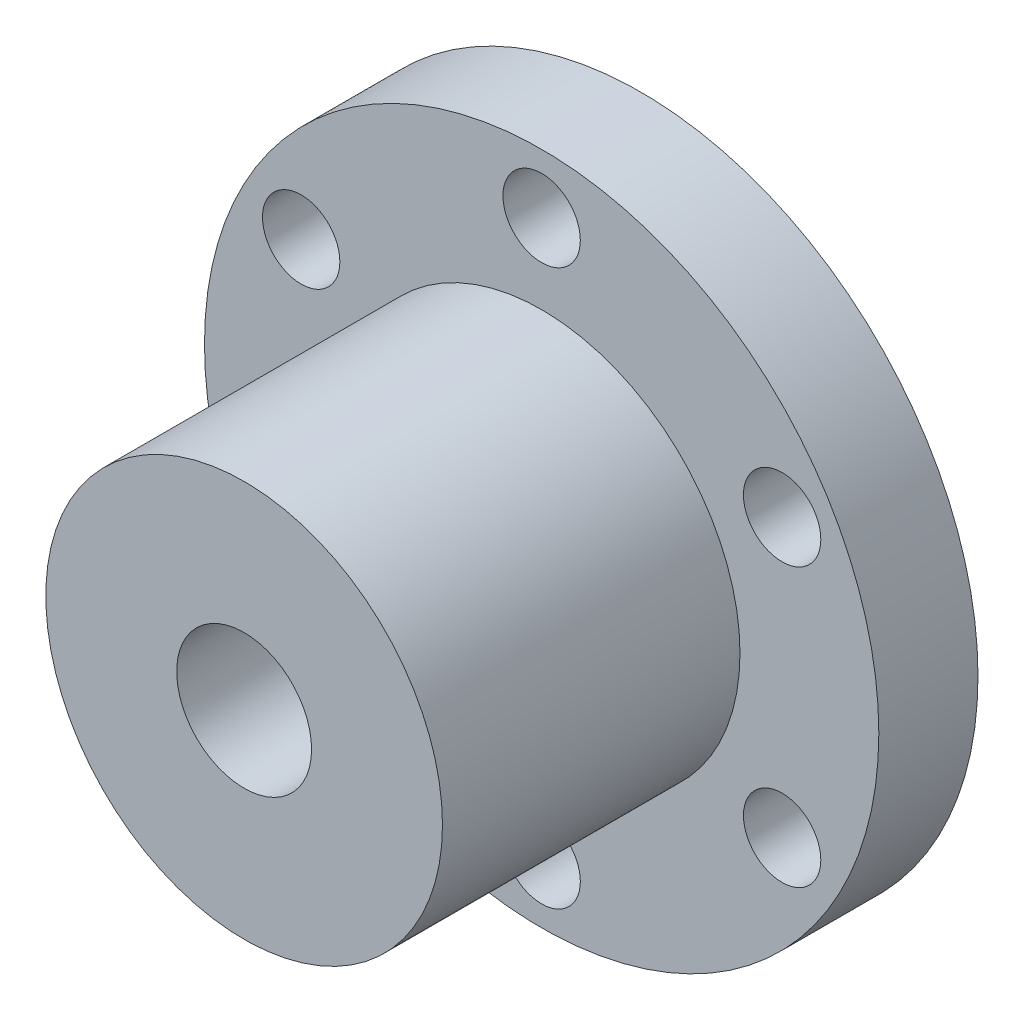
ISO-10303-21;
HEADER;
FILE_DESCRIPTION(('STEP AP214'),'2;1');
FILE_NAME('part.step','',(''),(''),'','','');
FILE_SCHEMA(('AUTOMOTIVE_DESIGN { 1 0 10303 214 1 1 1 1 }'));
ENDSEC;
DATA;
#1=APPLICATION_CONTEXT('core data for automotive mechanical design processes');
#2=APPLICATION_PROTOCOL_DEFINITION('international standard','automotive_design',2000,#1);
#3=PRODUCT_CONTEXT('',#1,'mechanical');
#4=PRODUCT('Part','Part','',(#3));
#5=PRODUCT_RELATED_PRODUCT_CATEGORY('part','',(#4));
#6=PRODUCT_DEFINITION_FORMATION('','',#4);
#7=PRODUCT_DEFINITION_CONTEXT('part definition',#1,'design');
#8=PRODUCT_DEFINITION('design','',#6,#7);
#9=PRODUCT_DEFINITION_SHAPE('','',#8);
#10=(LENGTH_UNIT() NAMED_UNIT(*) SI_UNIT(.MILLI.,.METRE.));
#11=(NAMED_UNIT(*) PLANE_ANGLE_UNIT() SI_UNIT($,.RADIAN.));
#12=(NAMED_UNIT(*) SI_UNIT($,.STERADIAN.) SOLID_ANGLE_UNIT());
#13=UNCERTAINTY_MEASURE_WITH_UNIT(LENGTH_MEASURE(1.E-05),#10,'distance_accuracy_value','');
#14=(GEOMETRIC_REPRESENTATION_CONTEXT(3) GLOBAL_UNCERTAINTY_ASSIGNED_CONTEXT((#13)) GLOBAL_UNIT_ASSIGNED_CONTEXT((#10,
#11,#12)) REPRESENTATION_CONTEXT('',''));
#15=CARTESIAN_POINT('',(0.,0.,0.));
#16=DIRECTION('',(0.,0.,1.));
#17=DIRECTION('',(1.,0.,0.));
#18=AXIS2_PLACEMENT_3D('',#15,#16,#17);
#19=CARTESIAN_POINT('',(0.,0.,0.));
#20=DIRECTION('',(0.,0.,-1.));
#21=DIRECTION('',(-1.,0.,0.));
#22=AXIS2_PLACEMENT_3D('',#19,#20,#21);
#23=PLANE('',#22);
#24=CARTESIAN_POINT('',(12.1243556529821,7.00000000000014,0.));
#25=DIRECTION('',(0.,0.,-1.));
#26=DIRECTION('',(-1.,0.,0.));
#27=AXIS2_PLACEMENT_3D('',#24,#25,#26);
#28=CIRCLE('',#27,1.94999999999994);
#29=CARTESIAN_POINT('',(10.1743556529821,7.00000000000014,0.));
#30=VERTEX_POINT('',#29);
#31=EDGE_CURVE('E94',#30,#30,#28,.T.);
#32=ORIENTED_EDGE('',*,*,#31,.F.);
#33=EDGE_LOOP('',(#32));
#34=FACE_BOUND('',#33,.T.);
#35=CARTESIAN_POINT('',(12.1243556529822,-6.99999999999989,0.));
#36=DIRECTION('',(0.,0.,-1.));
#37=DIRECTION('',(-1.,0.,0.));
#38=AXIS2_PLACEMENT_3D('',#35,#36,#37);
#39=CIRCLE('',#38,1.94999999999994);
#40=CARTESIAN_POINT('',(10.1743556529823,-6.99999999999989,0.));
#41=VERTEX_POINT('',#40);
#42=EDGE_CURVE('E88',#41,#41,#39,.T.);
#43=ORIENTED_EDGE('',*,*,#42,.F.);
#44=EDGE_LOOP('',(#43));
#45=FACE_BOUND('',#44,.T.);
#46=CARTESIAN_POINT('',(0.,-14.,0.));
#47=DIRECTION('',(0.,0.,-1.));
#48=DIRECTION('',(-1.,0.,0.));
#49=AXIS2_PLACEMENT_3D('',#46,#47,#48);
#50=CIRCLE('',#49,1.94999999999994);
#51=CARTESIAN_POINT('',(-1.94999999999994,-14.,0.));
#52=VERTEX_POINT('',#51);
#53=EDGE_CURVE('E82',#52,#52,#50,.T.);
#54=ORIENTED_EDGE('',*,*,#53,.F.);
#55=EDGE_LOOP('',(#54));
#56=FACE_BOUND('',#55,.T.);
#57=CARTESIAN_POINT('',(-12.1243556529821,-7.00000000000006,0.));
#58=DIRECTION('',(0.,0.,-1.));
#59=DIRECTION('',(-1.,0.,0.));
#60=AXIS2_PLACEMENT_3D('',#57,#58,#59);
#61=CIRCLE('',#60,1.94999999999994);
#62=CARTESIAN_POINT('',(-14.0743556529821,-7.00000000000006,0.));
#63=VERTEX_POINT('',#62);
#64=EDGE_CURVE('E76',#63,#63,#61,.T.);
#65=ORIENTED_EDGE('',*,*,#64,.F.);
#66=EDGE_LOOP('',(#65));
#67=FACE_BOUND('',#66,.T.);
#68=CARTESIAN_POINT('',(-12.1243556529822,6.99999999999997,0.));
#69=DIRECTION('',(0.,0.,-1.));
#70=DIRECTION('',(-1.,0.,0.));
#71=AXIS2_PLACEMENT_3D('',#68,#69,#70);
#72=CIRCLE('',#71,1.94999999999994);
#73=CARTESIAN_POINT('',(-14.0743556529821,6.99999999999997,0.));
#74=VERTEX_POINT('',#73);
#75=EDGE_CURVE('E70',#74,#74,#72,.T.);
#76=ORIENTED_EDGE('',*,*,#75,.F.);
#77=EDGE_LOOP('',(#76));
#78=FACE_BOUND('',#77,.T.);
#79=CARTESIAN_POINT('',(0.,14.,0.));
#80=DIRECTION('',(0.,0.,-1.));
#81=DIRECTION('',(-1.,0.,0.));
#82=AXIS2_PLACEMENT_3D('',#79,#80,#81);
#83=CIRCLE('',#82,1.94999999999994);
#84=CARTESIAN_POINT('',(-1.94999999999994,14.,0.));
#85=VERTEX_POINT('',#84);
#86=EDGE_CURVE('E64',#85,#85,#83,.T.);
#87=ORIENTED_EDGE('',*,*,#86,.F.);
#88=EDGE_LOOP('',(#87));
#89=FACE_BOUND('',#88,.T.);
#90=CARTESIAN_POINT('',(0.,0.,0.));
#91=DIRECTION('',(0.,0.,-1.));
#92=DIRECTION('',(-1.,0.,0.));
#93=AXIS2_PLACEMENT_3D('',#90,#91,#92);
#94=CIRCLE('',#93,3.4);
#95=CARTESIAN_POINT('',(-3.4,0.,0.));
#96=VERTEX_POINT('',#95);
#97=EDGE_CURVE('E55',#96,#96,#94,.T.);
#98=ORIENTED_EDGE('',*,*,#97,.F.);
#99=EDGE_LOOP('',(#98));
#100=FACE_BOUND('',#99,.T.);
#101=CARTESIAN_POINT('',(0.,0.,0.));
#102=DIRECTION('',(0.,0.,1.));
#103=DIRECTION('',(1.,0.,0.));
#104=AXIS2_PLACEMENT_3D('',#101,#102,#103);
#105=CIRCLE('',#104,17.);
#106=CARTESIAN_POINT('',(17.,0.,0.));
#107=VERTEX_POINT('',#106);
#108=EDGE_CURVE('E10',#107,#107,#105,.T.);
#109=ORIENTED_EDGE('',*,*,#108,.F.);
#110=EDGE_LOOP('',(#109));
#111=FACE_BOUND('',#110,.T.);
#112=ADVANCED_FACE('F36',(#34,#45,#56,#67,#78,#89,#100,#111),#23,.T.);
#113=CARTESIAN_POINT('',(0.,0.,0.));
#114=DIRECTION('',(0.,0.,1.));
#115=DIRECTION('',(1.,0.,0.));
#116=AXIS2_PLACEMENT_3D('',#113,#114,#115);
#117=CYLINDRICAL_SURFACE('',#116,17.);
#118=ORIENTED_EDGE('',*,*,#108,.T.);
#119=EDGE_LOOP('',(#118));
#120=FACE_BOUND('',#119,.T.);
#121=CARTESIAN_POINT('',(0.,0.,5.));
#122=DIRECTION('',(0.,0.,1.));
#123=DIRECTION('',(1.,0.,0.));
#124=AXIS2_PLACEMENT_3D('',#121,#122,#123);
#125=CIRCLE('',#124,17.);
#126=CARTESIAN_POINT('',(17.,0.,5.));
#127=VERTEX_POINT('',#126);
#128=EDGE_CURVE('E42',#127,#127,#125,.T.);
#129=ORIENTED_EDGE('',*,*,#128,.F.);
#130=EDGE_LOOP('',(#129));
#131=FACE_BOUND('',#130,.T.);
#132=ADVANCED_FACE('F102',(#120,#131),#117,.T.);
#133=CARTESIAN_POINT('',(17.,0.,5.));
#134=DIRECTION('',(0.,0.,1.));
#135=DIRECTION('',(1.,0.,0.));
#136=AXIS2_PLACEMENT_3D('',#133,#134,#135);
#137=PLANE('',#136);
#138=CARTESIAN_POINT('',(12.1243556529821,7.00000000000014,5.));
#139=DIRECTION('',(0.,0.,1.));
#140=DIRECTION('',(1.,0.,0.));
#141=AXIS2_PLACEMENT_3D('',#138,#139,#140);
#142=CIRCLE('',#141,1.94999999999991);
#143=CARTESIAN_POINT('',(14.074355652982,7.00000000000014,5.));
#144=VERTEX_POINT('',#143);
#145=EDGE_CURVE('E91',#144,#144,#142,.T.);
#146=ORIENTED_EDGE('',*,*,#145,.F.);
#147=EDGE_LOOP('',(#146));
#148=FACE_BOUND('',#147,.T.);
#149=CARTESIAN_POINT('',(12.1243556529822,-6.99999999999989,5.));
#150=DIRECTION('',(0.,0.,1.));
#151=DIRECTION('',(1.,0.,0.));
#152=AXIS2_PLACEMENT_3D('',#149,#150,#151);
#153=CIRCLE('',#152,1.94999999999991);
#154=CARTESIAN_POINT('',(14.0743556529821,-6.99999999999989,5.));
#155=VERTEX_POINT('',#154);
#156=EDGE_CURVE('E85',#155,#155,#153,.T.);
#157=ORIENTED_EDGE('',*,*,#156,.F.);
#158=EDGE_LOOP('',(#157));
#159=FACE_BOUND('',#158,.T.);
#160=CARTESIAN_POINT('',(0.,-14.,5.));
#161=DIRECTION('',(0.,0.,1.));
#162=DIRECTION('',(1.,0.,0.));
#163=AXIS2_PLACEMENT_3D('',#160,#161,#162);
#164=CIRCLE('',#163,1.94999999999991);
#165=CARTESIAN_POINT('',(1.94999999999991,-14.,5.));
#166=VERTEX_POINT('',#165);
#167=EDGE_CURVE('E79',#166,#166,#164,.T.);
#168=ORIENTED_EDGE('',*,*,#167,.F.);
#169=EDGE_LOOP('',(#168));
#170=FACE_BOUND('',#169,.T.);
#171=CARTESIAN_POINT('',(-12.1243556529821,-7.00000000000006,5.));
#172=DIRECTION('',(0.,0.,1.));
#173=DIRECTION('',(1.,0.,0.));
#174=AXIS2_PLACEMENT_3D('',#171,#172,#173);
#175=CIRCLE('',#174,1.94999999999991);
#176=CARTESIAN_POINT('',(-10.1743556529822,-7.00000000000006,5.));
#177=VERTEX_POINT('',#176);
#178=EDGE_CURVE('E73',#177,#177,#175,.T.);
#179=ORIENTED_EDGE('',*,*,#178,.F.);
#180=EDGE_LOOP('',(#179));
#181=FACE_BOUND('',#180,.T.);
#182=CARTESIAN_POINT('',(-12.1243556529822,6.99999999999997,5.));
#183=DIRECTION('',(0.,0.,1.));
#184=DIRECTION('',(1.,0.,0.));
#185=AXIS2_PLACEMENT_3D('',#182,#183,#184);
#186=CIRCLE('',#185,1.94999999999991);
#187=CARTESIAN_POINT('',(-10.1743556529823,6.99999999999997,5.));
#188=VERTEX_POINT('',#187);
#189=EDGE_CURVE('E67',#188,#188,#186,.T.);
#190=ORIENTED_EDGE('',*,*,#189,.F.);
#191=EDGE_LOOP('',(#190));
#192=FACE_BOUND('',#191,.T.);
#193=CARTESIAN_POINT('',(0.,14.,5.));
#194=DIRECTION('',(0.,0.,1.));
#195=DIRECTION('',(1.,0.,0.));
#196=AXIS2_PLACEMENT_3D('',#193,#194,#195);
#197=CIRCLE('',#196,1.94999999999991);
#198=CARTESIAN_POINT('',(1.94999999999991,14.,5.));
#199=VERTEX_POINT('',#198);
#200=EDGE_CURVE('E61',#199,#199,#197,.T.);
#201=ORIENTED_EDGE('',*,*,#200,.F.);
#202=EDGE_LOOP('',(#201));
#203=FACE_BOUND('',#202,.T.);
#204=ORIENTED_EDGE('',*,*,#128,.T.);
#205=EDGE_LOOP('',(#204));
#206=FACE_BOUND('',#205,.T.);
#207=CARTESIAN_POINT('',(0.,0.,5.));
#208=DIRECTION('',(0.,0.,1.));
#209=DIRECTION('',(1.,0.,0.));
#210=AXIS2_PLACEMENT_3D('',#207,#208,#209);
#211=CIRCLE('',#210,10.);
#212=CARTESIAN_POINT('',(10.,0.,5.));
#213=VERTEX_POINT('',#212);
#214=EDGE_CURVE('E46',#213,#213,#211,.T.);
#215=ORIENTED_EDGE('',*,*,#214,.F.);
#216=EDGE_LOOP('',(#215));
#217=FACE_BOUND('',#216,.T.);
#218=ADVANCED_FACE('F131',(#148,#159,#170,#181,#192,#203,#206,#217),#137,.T.);
#219=CARTESIAN_POINT('',(0.,0.,0.));
#220=DIRECTION('',(0.,0.,1.));
#221=DIRECTION('',(1.,0.,0.));
#222=AXIS2_PLACEMENT_3D('',#219,#220,#221);
#223=CYLINDRICAL_SURFACE('',#222,10.);
#224=ORIENTED_EDGE('',*,*,#214,.T.);
#225=EDGE_LOOP('',(#224));
#226=FACE_BOUND('',#225,.T.);
#227=CARTESIAN_POINT('',(0.,0.,20.));
#228=DIRECTION('',(0.,0.,1.));
#229=DIRECTION('',(1.,0.,0.));
#230=AXIS2_PLACEMENT_3D('',#227,#228,#229);
#231=CIRCLE('',#230,10.);
#232=CARTESIAN_POINT('',(10.,0.,20.));
#233=VERTEX_POINT('',#232);
#234=EDGE_CURVE('E50',#233,#233,#231,.T.);
#235=ORIENTED_EDGE('',*,*,#234,.F.);
#236=EDGE_LOOP('',(#235));
#237=FACE_BOUND('',#236,.T.);
#238=ADVANCED_FACE('F126',(#226,#237),#223,.T.);
#239=CARTESIAN_POINT('',(10.,0.,20.));
#240=DIRECTION('',(0.,0.,1.));
#241=DIRECTION('',(1.,0.,0.));
#242=AXIS2_PLACEMENT_3D('',#239,#240,#241);
#243=PLANE('',#242);
#244=CARTESIAN_POINT('',(0.,0.,20.));
#245=DIRECTION('',(0.,0.,1.));
#246=DIRECTION('',(1.,0.,0.));
#247=AXIS2_PLACEMENT_3D('',#244,#245,#246);
#248=CIRCLE('',#247,3.4);
#249=CARTESIAN_POINT('',(3.4,0.,20.));
#250=VERTEX_POINT('',#249);
#251=EDGE_CURVE('E58',#250,#250,#248,.T.);
#252=ORIENTED_EDGE('',*,*,#251,.F.);
#253=EDGE_LOOP('',(#252));
#254=FACE_BOUND('',#253,.T.);
#255=ORIENTED_EDGE('',*,*,#234,.T.);
#256=EDGE_LOOP('',(#255));
#257=FACE_BOUND('',#256,.T.);
#258=ADVANCED_FACE('F120',(#254,#257),#243,.T.);
#259=CARTESIAN_POINT('',(0.,0.,20.));
#260=DIRECTION('',(0.,0.,1.));
#261=DIRECTION('',(1.,0.,0.));
#262=AXIS2_PLACEMENT_3D('',#259,#260,#261);
#263=CYLINDRICAL_SURFACE('',#262,3.4);
#264=ORIENTED_EDGE('',*,*,#97,.T.);
#265=EDGE_LOOP('',(#264));
#266=FACE_BOUND('',#265,.T.);
#267=ORIENTED_EDGE('',*,*,#251,.T.);
#268=EDGE_LOOP('',(#267));
#269=FACE_BOUND('',#268,.T.);
#270=ADVANCED_FACE('F116',(#266,#269),#263,.F.);
#271=CARTESIAN_POINT('',(0.,14.,0.));
#272=DIRECTION('',(0.,0.,-1.));
#273=DIRECTION('',(-1.,0.,0.));
#274=AXIS2_PLACEMENT_3D('',#271,#272,#273);
#275=CYLINDRICAL_SURFACE('',#274,1.94999999999991);
#276=ORIENTED_EDGE('',*,*,#200,.T.);
#277=EDGE_LOOP('',(#276));
#278=FACE_BOUND('',#277,.T.);
#279=ORIENTED_EDGE('',*,*,#86,.T.);
#280=EDGE_LOOP('',(#279));
#281=FACE_BOUND('',#280,.T.);
#282=ADVANCED_FACE('F119',(#278,#281),#275,.F.);
#283=CARTESIAN_POINT('',(-12.1243556529822,6.99999999999997,0.));
#284=DIRECTION('',(0.,0.,-1.));
#285=DIRECTION('',(-1.,0.,0.));
#286=AXIS2_PLACEMENT_3D('',#283,#284,#285);
#287=CYLINDRICAL_SURFACE('',#286,1.94999999999991);
#288=ORIENTED_EDGE('',*,*,#189,.T.);
#289=EDGE_LOOP('',(#288));
#290=FACE_BOUND('',#289,.T.);
#291=ORIENTED_EDGE('',*,*,#75,.T.);
#292=EDGE_LOOP('',(#291));
#293=FACE_BOUND('',#292,.T.);
#294=ADVANCED_FACE('F158',(#290,#293),#287,.F.);
#295=CARTESIAN_POINT('',(-12.1243556529821,-7.00000000000006,0.));
#296=DIRECTION('',(0.,0.,-1.));
#297=DIRECTION('',(-1.,0.,0.));
#298=AXIS2_PLACEMENT_3D('',#295,#296,#297);
#299=CYLINDRICAL_SURFACE('',#298,1.94999999999991);
#300=ORIENTED_EDGE('',*,*,#178,.T.);
#301=EDGE_LOOP('',(#300));
#302=FACE_BOUND('',#301,.T.);
#303=ORIENTED_EDGE('',*,*,#64,.T.);
#304=EDGE_LOOP('',(#303));
#305=FACE_BOUND('',#304,.T.);
#306=ADVANCED_FACE('F163',(#302,#305),#299,.F.);
#307=CARTESIAN_POINT('',(0.,-14.,0.));
#308=DIRECTION('',(0.,0.,-1.));
#309=DIRECTION('',(-1.,0.,0.));
#310=AXIS2_PLACEMENT_3D('',#307,#308,#309);
#311=CYLINDRICAL_SURFACE('',#310,1.94999999999991);
#312=ORIENTED_EDGE('',*,*,#167,.T.);
#313=EDGE_LOOP('',(#312));
#314=FACE_BOUND('',#313,.T.);
#315=ORIENTED_EDGE('',*,*,#53,.T.);
#316=EDGE_LOOP('',(#315));
#317=FACE_BOUND('',#316,.T.);
#318=ADVANCED_FACE('F175',(#314,#317),#311,.F.);
#319=CARTESIAN_POINT('',(12.1243556529822,-6.99999999999989,0.));
#320=DIRECTION('',(0.,0.,-1.));
#321=DIRECTION('',(-1.,0.,0.));
#322=AXIS2_PLACEMENT_3D('',#319,#320,#321);
#323=CYLINDRICAL_SURFACE('',#322,1.94999999999991);
#324=ORIENTED_EDGE('',*,*,#156,.T.);
#325=EDGE_LOOP('',(#324));
#326=FACE_BOUND('',#325,.T.);
#327=ORIENTED_EDGE('',*,*,#42,.T.);
#328=EDGE_LOOP('',(#327));
#329=FACE_BOUND('',#328,.T.);
#330=ADVANCED_FACE('F185',(#326,#329),#323,.F.);
#331=CARTESIAN_POINT('',(12.1243556529821,7.00000000000014,0.));
#332=DIRECTION('',(0.,0.,-1.));
#333=DIRECTION('',(-1.,0.,0.));
#334=AXIS2_PLACEMENT_3D('',#331,#332,#333);
#335=CYLINDRICAL_SURFACE('',#334,1.94999999999991);
#336=ORIENTED_EDGE('',*,*,#145,.T.);
#337=EDGE_LOOP('',(#336));
#338=FACE_BOUND('',#337,.T.);
#339=ORIENTED_EDGE('',*,*,#31,.T.);
#340=EDGE_LOOP('',(#339));
#341=FACE_BOUND('',#340,.T.);
#342=ADVANCED_FACE('F98',(#338,#341),#335,.F.);
#343=CLOSED_SHELL('',(#112,#132,#218,#238,#258,#270,#282,#294,#306,#318,#330,#342));
#344=MANIFOLD_SOLID_BREP('B2',#343);
#345=ADVANCED_BREP_SHAPE_REPRESENTATION('',(#18,#344),#14);
#346=SHAPE_DEFINITION_REPRESENTATION(#9,#345);
ENDSEC;
END-ISO-10303-21;
